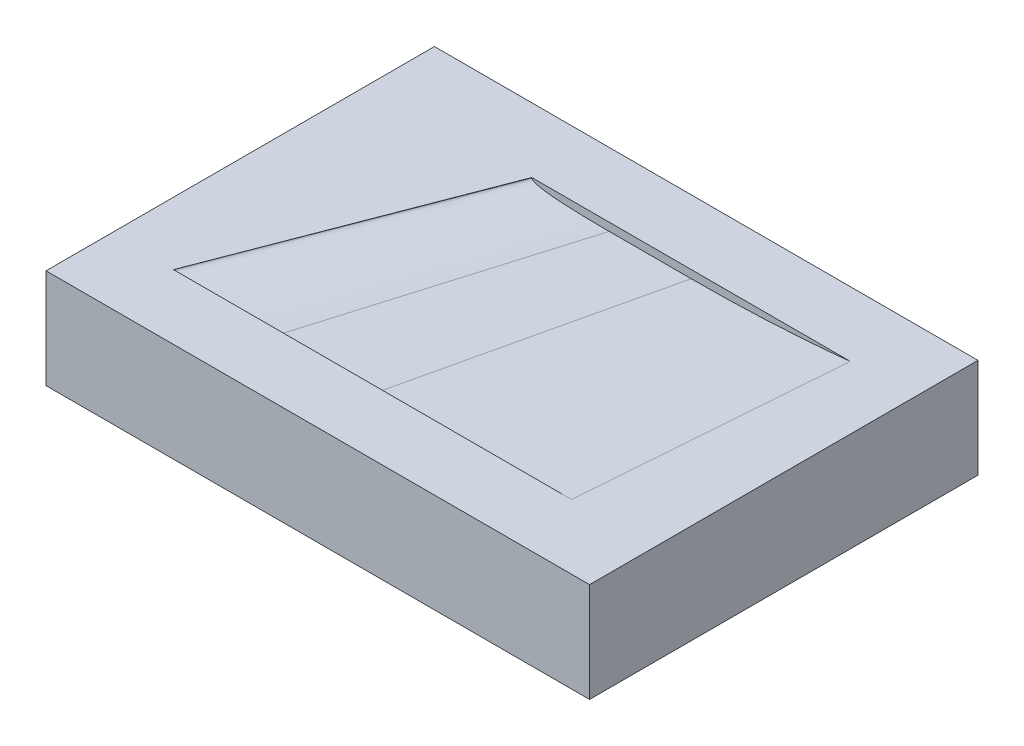
ISO-10303-21;
HEADER;
FILE_DESCRIPTION(('STEP AP214'),'2;1');
FILE_NAME('part.step','',(''),(''),'','','');
FILE_SCHEMA(('AUTOMOTIVE_DESIGN { 1 0 10303 214 1 1 1 1 }'));
ENDSEC;
DATA;
#1=APPLICATION_CONTEXT('core data for automotive mechanical design processes');
#2=APPLICATION_PROTOCOL_DEFINITION('international standard','automotive_design',2000,#1);
#3=PRODUCT_CONTEXT('',#1,'mechanical');
#4=PRODUCT('Part','Part','',(#3));
#5=PRODUCT_RELATED_PRODUCT_CATEGORY('part','',(#4));
#6=PRODUCT_DEFINITION_FORMATION('','',#4);
#7=PRODUCT_DEFINITION_CONTEXT('part definition',#1,'design');
#8=PRODUCT_DEFINITION('design','',#6,#7);
#9=PRODUCT_DEFINITION_SHAPE('','',#8);
#10=(LENGTH_UNIT() NAMED_UNIT(*) SI_UNIT(.MILLI.,.METRE.));
#11=(NAMED_UNIT(*) PLANE_ANGLE_UNIT() SI_UNIT($,.RADIAN.));
#12=(NAMED_UNIT(*) SI_UNIT($,.STERADIAN.) SOLID_ANGLE_UNIT());
#13=UNCERTAINTY_MEASURE_WITH_UNIT(LENGTH_MEASURE(1.E-05),#10,'distance_accuracy_value','');
#14=(GEOMETRIC_REPRESENTATION_CONTEXT(3) GLOBAL_UNCERTAINTY_ASSIGNED_CONTEXT((#13)) GLOBAL_UNIT_ASSIGNED_CONTEXT((#10,
#11,#12)) REPRESENTATION_CONTEXT('',''));
#15=CARTESIAN_POINT('',(0.,0.,0.));
#16=DIRECTION('',(0.,0.,1.));
#17=DIRECTION('',(1.,0.,0.));
#18=AXIS2_PLACEMENT_3D('',#15,#16,#17);
#19=CARTESIAN_POINT('',(-147.817686270369,-0.235238182718216,-4.69913597611729));
#20=DIRECTION('',(0.,-1.,0.));
#21=DIRECTION('',(1.,0.,0.));
#22=AXIS2_PLACEMENT_3D('',#19,#20,#21);
#23=PLANE('',#22);
#24=DIRECTION('',(-1.,0.,0.));
#25=VECTOR('',#24,1.);
#26=CARTESIAN_POINT('',(0.,-0.235238182718225,-4.68913597611729));
#27=LINE('',#26,#25);
#28=CARTESIAN_POINT('',(-11.3817993338851,-0.235238182718221,-4.68913597611729));
#29=VERTEX_POINT('',#28);
#30=CARTESIAN_POINT('',(-147.817686270369,-0.235238182718221,-4.68913597611729));
#31=VERTEX_POINT('',#30);
#32=EDGE_CURVE('E124',#29,#31,#27,.T.);
#33=ORIENTED_EDGE('',*,*,#32,.T.);
#34=DIRECTION('',(0.,0.,-1.));
#35=VECTOR('',#34,1.);
#36=CARTESIAN_POINT('',(-147.817686270369,-0.235238182718218,-4.68913597611729));
#37=LINE('',#36,#35);
#38=CARTESIAN_POINT('',(-147.817686270369,-0.235238182718221,92.8108640238827));
#39=VERTEX_POINT('',#38);
#40=EDGE_CURVE('E201',#39,#31,#37,.T.);
#41=ORIENTED_EDGE('',*,*,#40,.F.);
#42=DIRECTION('',(-1.,0.,0.));
#43=VECTOR('',#42,1.);
#44=CARTESIAN_POINT('',(0.,-0.235238182718225,92.8108640238827));
#45=LINE('',#44,#43);
#46=CARTESIAN_POINT('',(-11.3817993338851,-0.235238182718221,92.8108640238827));
#47=VERTEX_POINT('',#46);
#48=EDGE_CURVE('E199',#47,#39,#45,.T.);
#49=ORIENTED_EDGE('',*,*,#48,.F.);
#50=DIRECTION('',(0.,0.,1.));
#51=VECTOR('',#50,1.);
#52=CARTESIAN_POINT('',(-11.3817993338851,-0.235238182718225,-4.68913597611729));
#53=LINE('',#52,#51);
#54=EDGE_CURVE('E203',#29,#47,#53,.T.);
#55=ORIENTED_EDGE('',*,*,#54,.F.);
#56=EDGE_LOOP('',(#33,#41,#49,#55));
#57=FACE_BOUND('',#56,.T.);
#58=DIRECTION('',(-1.,0.,0.));
#59=VECTOR('',#58,1.);
#60=CARTESIAN_POINT('',(-132.075563950012,-0.235238182718217,76.5608640238827));
#61=LINE('',#60,#59);
#62=CARTESIAN_POINT('',(-32.1504797007613,-0.235238182700013,76.5608640238827));
#63=VERTEX_POINT('',#62);
#64=CARTESIAN_POINT('',(-132.07520257422,-0.235238183928665,76.5608238745016));
#65=VERTEX_POINT('',#64);
#66=EDGE_CURVE('E41',#63,#65,#61,.T.);
#67=ORIENTED_EDGE('',*,*,#66,.T.);
#68=CARTESIAN_POINT('',(-132.075140131394,-0.235238182718217,76.5608640238827));
#69=DIRECTION('',(0.358325636283721,0.,-0.933596667936356));
#70=VECTOR('',#69,1.);
#71=LINE('',#68,#70);
#72=CARTESIAN_POINT('',(-128.946982261466,-0.235238182718218,68.4106300790482));
#73=VERTEX_POINT('',#72);
#74=EDGE_CURVE('E54',#65,#73,#71,.T.);
#75=ORIENTED_EDGE('',*,*,#74,.T.);
#76=DIRECTION('',(0.358367949545301,0.,-0.933580426497201));
#77=VECTOR('',#76,1.);
#78=CARTESIAN_POINT('',(-132.075563950012,-0.235238182718217,76.5608640238827));
#79=LINE('',#78,#77);
#80=CARTESIAN_POINT('',(-107.12440167271,-0.235238182718219,11.5608640238827));
#81=VERTEX_POINT('',#80);
#82=EDGE_CURVE('E281',#73,#81,#79,.T.);
#83=ORIENTED_EDGE('',*,*,#82,.T.);
#84=DIRECTION('',(1.,0.,0.));
#85=VECTOR('',#84,1.);
#86=CARTESIAN_POINT('',(-107.12440167271,-0.235238182718219,11.5608640238827));
#87=LINE('',#86,#85);
#88=CARTESIAN_POINT('',(-27.1842803764092,-0.235238182700013,11.5608640238827));
#89=VERTEX_POINT('',#88);
#90=EDGE_CURVE('E11',#81,#89,#87,.T.);
#91=ORIENTED_EDGE('',*,*,#90,.T.);
#92=CARTESIAN_POINT('',(-27.1842803763695,-0.235238182711103,11.5608640238827));
#93=CARTESIAN_POINT('',(-27.8205460887043,-0.235238182715707,19.8886150074807));
#94=CARTESIAN_POINT('',(-28.4568118010935,-0.235238182717574,28.2163659910745));
#95=CARTESIAN_POINT('',(-29.6026445446678,-0.235238182718744,43.2135748162056));
#96=CARTESIAN_POINT('',(-30.1122115758443,-0.235238182718483,49.8830326577435));
#97=CARTESIAN_POINT('',(-31.131345638197,-0.235238182717962,63.2219483408148));
#98=CARTESIAN_POINT('',(-31.6409126693731,-0.235238182717702,69.8914061823481));
#99=CARTESIAN_POINT('',(-32.1504797005338,-0.235238182718222,76.5608640238827));
#100=B_SPLINE_CURVE_WITH_KNOTS('',3,(#92,#93,#94,#95,#96,#97,#98,#99),.UNSPECIFIED.,.F.,.F.,(4,
2,2,4),(0.,25.0560658227422,45.1227530962764,65.1894403697971),.UNSPECIFIED.);
#101=EDGE_CURVE('E63',#89,#63,#100,.T.);
#102=ORIENTED_EDGE('',*,*,#101,.T.);
#103=EDGE_LOOP('',(#67,#75,#83,#91,#102));
#104=FACE_BOUND('',#103,.T.);
#105=ADVANCED_FACE('F37',(#57,#104),#23,.F.);
#106=CARTESIAN_POINT('',(-32.0755639500123,-0.241240383306461,76.5608640238827));
#107=CARTESIAN_POINT('',(-30.4251765242449,-0.241240383306461,54.8941973572161));
#108=CARTESIAN_POINT('',(-28.7747890984775,-0.241240383306461,33.2275306905494));
#109=CARTESIAN_POINT('',(-27.1244016727102,-0.241240383306461,11.5608640238827));
#110=CARTESIAN_POINT('',(-36.2328863128886,0.0920929500268473,76.5608640238827));
#111=CARTESIAN_POINT('',(-34.3043455878615,0.0920929500268556,54.8941973572161));
#112=CARTESIAN_POINT('',(-32.3758048628345,0.0920929500268634,33.2275306905494));
#113=CARTESIAN_POINT('',(-30.4472641378075,0.0920929500268716,11.5608640238827));
#114=CARTESIAN_POINT('',(-44.5522031905363,0.675426283360143,76.5608640238827));
#115=CARTESIAN_POINT('',(-42.0675436277309,0.675426283360164,54.8941973572161));
#116=CARTESIAN_POINT('',(-39.5828840649255,0.675426283360184,33.2275306905494));
#117=CARTESIAN_POINT('',(-37.0982245021201,0.675426283360204,11.5608640238827));
#118=CARTESIAN_POINT('',(-57.0451949626936,1.30042628336013,76.5608640238827));
#119=CARTESIAN_POINT('',(-53.7269204254434,1.30042628336015,54.894197357216));
#120=CARTESIAN_POINT('',(-50.4086458881933,1.30042628336018,33.2275306905493));
#121=CARTESIAN_POINT('',(-47.0903713509431,1.3004262833602,11.5608640238827));
#122=CARTESIAN_POINT('',(-69.5522031905364,1.67542628336014,76.5608640238827));
#123=CARTESIAN_POINT('',(-65.4008769610643,1.67542628336016,54.8941973572161));
#124=CARTESIAN_POINT('',(-61.2495507315922,1.67542628336018,33.2275306905494));
#125=CARTESIAN_POINT('',(-57.0982245021201,1.6754262833602,11.5608640238828));
#126=CARTESIAN_POINT('',(-77.8995529795552,1.75875961669351,76.5608640238827));
#127=CARTESIAN_POINT('',(-73.1932344767504,1.75875961669352,54.8941973572161));
#128=CARTESIAN_POINT('',(-68.4869159739456,1.75875961669353,33.2275306905494));
#129=CARTESIAN_POINT('',(-63.7805974711408,1.75875961669354,11.5608640238827));
#130=CARTESIAN_POINT('',(-82.0755639500123,1.75875961669354,76.5608640238827));
#131=CARTESIAN_POINT('',(-77.0918431909116,1.75875961669354,54.8941973572161));
#132=CARTESIAN_POINT('',(-72.1081224318109,1.75875961669354,33.2275306905494));
#133=CARTESIAN_POINT('',(-67.1244016727102,1.75875961669354,11.5608640238827));
#134=B_SPLINE_SURFACE_WITH_KNOTS('',3,3,((#106,#107,#108,#109),(#110,#111,#112,#113),(#114,#115,
#116,#117),(#118,#119,#120,#121),(#122,#123,#124,#125),(#126,#127,#128,#129),(#130,#131,#132,
#133)),.UNSPECIFIED.,.F.,.F.,.F.,(4,1,1,1,4),(4,4),(0.,0.122335441753358,0.244670883506716,
0.367006325260075,0.489341767013433),(0.,1.),.UNSPECIFIED.);
#135=CARTESIAN_POINT('',(-67.1244016727102,1.75875961669354,11.5608640238827));
#136=CARTESIAN_POINT('',(-47.0615764632941,1.75875961669354,11.5608640238827));
#137=CARTESIAN_POINT('',(-27.1244016727102,-0.241240383306461,11.5608640238827));
#138=B_SPLINE_CURVE_WITH_KNOTS('',2,(#135,#136,#137),.UNSPECIFIED.,.F.,.F.,(3,3),(0.,1.),.UNSPECIFIED.);
#139=CARTESIAN_POINT('',(-27.1244016727102,-0.241240383306461,11.5608640238827));
#140=VERTEX_POINT('',#139);
#141=EDGE_CURVE('E167',#89,#140,#138,.T.);
#142=DIRECTION('',(0.0759517051198801,0.,-0.997111497521407));
#143=VECTOR('',#142,1.);
#144=CARTESIAN_POINT('',(-29.5999828113612,-0.241240383306461,44.0608640238827));
#145=LINE('',#144,#143);
#146=CARTESIAN_POINT('',(-32.0755639500123,-0.241240383306461,76.5608640238827));
#147=VERTEX_POINT('',#146);
#148=EDGE_CURVE('E154',#147,#140,#145,.T.);
#149=CARTESIAN_POINT('',(-82.0755639500123,1.75875961669354,76.5608640238827));
#150=CARTESIAN_POINT('',(-57.0194981272701,1.75875961669339,76.5608640238827));
#151=CARTESIAN_POINT('',(-32.0755639500123,-0.241240383306461,76.5608640238827));
#152=B_SPLINE_CURVE_WITH_KNOTS('',2,(#149,#150,#151),.UNSPECIFIED.,.F.,.F.,(3,3),(0.,1.),.UNSPECIFIED.);
#153=EDGE_CURVE('E197',#63,#147,#152,.T.);
#154=ORIENTED_EDGE('',*,*,#101,.F.);
#155=ORIENTED_EDGE('',*,*,#141,.T.);
#156=ORIENTED_EDGE('',*,*,#148,.F.);
#157=ORIENTED_EDGE('',*,*,#153,.F.);
#158=EDGE_LOOP('',(#154,#155,#156,#157));
#159=FACE_BOUND('',#158,.T.);
#160=ADVANCED_FACE('F237',(#159),#134,.T.);
#161=CARTESIAN_POINT('',(-82.0755639500123,-2.24124038330646,76.5608640238827));
#162=CARTESIAN_POINT('',(-67.1244016727102,-2.24124038330646,11.5608640238827));
#163=CARTESIAN_POINT('',(-57.0194981272701,-2.24124038330631,76.5608640238827));
#164=CARTESIAN_POINT('',(-47.0615764632941,-2.24124038330646,11.5608640238827));
#165=CARTESIAN_POINT('',(-32.0755639500123,-0.241240383306461,76.5608640238827));
#166=CARTESIAN_POINT('',(-27.1244016727102,-0.241240383306461,11.5608640238827));
#167=B_SPLINE_SURFACE_WITH_KNOTS('',2,1,((#161,#162),(#163,#164),(#165,#166)),.UNSPECIFIED.,.F.,
.F.,.F.,(3,3),(2,2),(0.,1.),(0.,1.),.UNSPECIFIED.);
#168=CARTESIAN_POINT('',(-82.0755639500123,-2.24124038330646,76.5608640238827));
#169=CARTESIAN_POINT('',(-57.0194981272701,-2.24124038330631,76.5608640238827));
#170=CARTESIAN_POINT('',(-32.0755639500123,-0.241240383306461,76.5608640238827));
#171=B_SPLINE_CURVE_WITH_KNOTS('',2,(#168,#169,#170),.UNSPECIFIED.,.F.,.F.,(3,3),(0.,1.),.UNSPECIFIED.);
#172=CARTESIAN_POINT('',(-82.0755639500123,-2.24124038330646,76.5608640238827));
#173=VERTEX_POINT('',#172);
#174=EDGE_CURVE('E163',#173,#147,#171,.T.);
#175=CARTESIAN_POINT('',(-67.1244016727102,-2.24124038330646,11.5608640238827));
#176=CARTESIAN_POINT('',(-47.0615764632941,-2.24124038330646,11.5608640238827));
#177=CARTESIAN_POINT('',(-27.1244016727102,-0.241240383306461,11.5608640238827));
#178=B_SPLINE_CURVE_WITH_KNOTS('',2,(#175,#176,#177),.UNSPECIFIED.,.F.,.F.,(3,3),(0.,1.),.UNSPECIFIED.);
#179=CARTESIAN_POINT('',(-67.1244016727102,-2.24124038330646,11.5608640238827));
#180=VERTEX_POINT('',#179);
#181=EDGE_CURVE('E159',#180,#140,#178,.T.);
#182=DIRECTION('',(0.224164243499484,0.,-0.974551379833975));
#183=VECTOR('',#182,1.);
#184=CARTESIAN_POINT('',(-82.0755639500123,-2.24124038330646,76.5608640238827));
#185=LINE('',#184,#183);
#186=EDGE_CURVE('E158',#173,#180,#185,.T.);
#187=ORIENTED_EDGE('',*,*,#174,.T.);
#188=ORIENTED_EDGE('',*,*,#148,.T.);
#189=ORIENTED_EDGE('',*,*,#181,.F.);
#190=ORIENTED_EDGE('',*,*,#186,.F.);
#191=EDGE_LOOP('',(#187,#188,#189,#190));
#192=FACE_BOUND('',#191,.T.);
#193=ADVANCED_FACE('F242',(#192),#167,.T.);
#194=CARTESIAN_POINT('',(-132.075563950012,-0.241240383306461,76.5608640238827));
#195=CARTESIAN_POINT('',(-107.12440167271,-0.289109320673951,11.5608640238827));
#196=CARTESIAN_POINT('',(-132.068851844272,-0.35141683002973,76.5608640238827));
#197=CARTESIAN_POINT('',(-107.119167992619,-0.375211956609364,11.5608640238827));
#198=CARTESIAN_POINT('',(-131.949074539636,-0.526410123201769,76.5608640238828));
#199=CARTESIAN_POINT('',(-107.058214426977,-0.514133425696137,11.5608640238827));
#200=CARTESIAN_POINT('',(-131.758263658057,-0.655288657685514,76.5608640238827));
#201=CARTESIAN_POINT('',(-106.927122412681,-0.642017576442922,11.5608640238827));
#202=CARTESIAN_POINT('',(-131.453575460088,-0.825230430841971,76.5608640238826));
#203=CARTESIAN_POINT('',(-106.705011260519,-0.812986717959981,11.5608640238827));
#204=CARTESIAN_POINT('',(-131.171109632352,-0.92410562595963,76.5608640238826));
#205=CARTESIAN_POINT('',(-106.494612038344,-0.915826538155211,11.5608640238827));
#206=CARTESIAN_POINT('',(-130.587712513025,-1.09491573436706,76.5608640238827));
#207=CARTESIAN_POINT('',(-106.051383480333,-1.08798537267806,11.5608640238828));
#208=CARTESIAN_POINT('',(-130.178022398801,-1.18498161344138,76.5608640238827));
#209=CARTESIAN_POINT('',(-105.736258132447,-1.17930330978814,11.5608640238828));
#210=CARTESIAN_POINT('',(-129.178619839801,-1.37348519590354,76.5608640238828));
#211=CARTESIAN_POINT('',(-104.963558169305,-1.36805954177404,11.5608640238828));
#212=CARTESIAN_POINT('',(-128.462439032159,-1.47070214323913,76.5608640238828));
#213=CARTESIAN_POINT('',(-104.406904388195,-1.46606131852879,11.5608640238827));
#214=CARTESIAN_POINT('',(-127.173532932439,-1.6174453457072,76.5608640238827));
#215=CARTESIAN_POINT('',(-103.403134288348,-1.61272291381621,11.5608640238827));
#216=CARTESIAN_POINT('',(-126.474438820649,-1.68265651488475,76.5608640238827));
#217=CARTESIAN_POINT('',(-102.857955699797,-1.67796248823595,11.5608640238827));
#218=CARTESIAN_POINT('',(-124.168055687845,-1.87050332577562,76.5608640238827));
#219=CARTESIAN_POINT('',(-101.058209544952,-1.86535168991131,11.5608640238827));
#220=CARTESIAN_POINT('',(-122.441361531747,-1.95944003812852,76.5608640238827));
#221=CARTESIAN_POINT('',(-99.7090254395894,-1.95453311586651,11.5608640238827));
#222=CARTESIAN_POINT('',(-116.208678860393,-2.20644055577695,76.5608640238827));
#223=CARTESIAN_POINT('',(-94.8376681949716,-2.20172204963652,11.5608640238828));
#224=CARTESIAN_POINT('',(-111.62562716501,-2.24124038330646,76.5608640238827));
#225=CARTESIAN_POINT('',(-91.2534745936992,-2.23863983084044,11.5608640238827));
#226=CARTESIAN_POINT('',(-107.075563950012,-2.24124038330646,76.5608640238827));
#227=CARTESIAN_POINT('',(-87.6955032234398,-2.24124054963858,11.5608640238827));
#228=B_SPLINE_SURFACE_WITH_KNOTS('',3,1,((#194,#195),(#196,#197),(#198,#199),(#200,#201),(#202,
#203),(#204,#205),(#206,#207),(#208,#209),(#210,#211),(#212,#213),(#214,#215),(#216,#217),(#218,
#219),(#220,#221),(#222,#223),(#224,#225),(#226,#227)),.UNSPECIFIED.,.F.,.F.,.F.,(4,1,1,1,1,1,1,
1,1,1,1,1,1,1,4),(2,2),(0.,0.0130335558260233,0.0236646502785043,0.0270654432242707,
0.0543505595370666,0.0588989819291337,0.0988700618423399,0.103921517030962,0.179200697813376,
0.184331067599725,0.257356535356878,0.262237314930706,0.458038546790629,0.461820218702176,1.),
(0.,1.),.UNSPECIFIED.);
#229=CARTESIAN_POINT('',(-132.075563950012,-0.241240383306461,76.5608640238827));
#230=CARTESIAN_POINT('',(-132.068851844272,-0.35141683002973,76.5608640238827));
#231=CARTESIAN_POINT('',(-131.949074539636,-0.526410123201769,76.5608640238828));
#232=CARTESIAN_POINT('',(-131.758263658057,-0.655288657685514,76.5608640238827));
#233=CARTESIAN_POINT('',(-131.453575460088,-0.825230430841971,76.5608640238826));
#234=CARTESIAN_POINT('',(-131.171109632352,-0.92410562595963,76.5608640238826));
#235=CARTESIAN_POINT('',(-130.587712513025,-1.09491573436706,76.5608640238827));
#236=CARTESIAN_POINT('',(-130.178022398801,-1.18498161344138,76.5608640238827));
#237=CARTESIAN_POINT('',(-129.178619839801,-1.37348519590354,76.5608640238828));
#238=CARTESIAN_POINT('',(-128.462439032159,-1.47070214323913,76.5608640238828));
#239=CARTESIAN_POINT('',(-127.173532932439,-1.6174453457072,76.5608640238827));
#240=CARTESIAN_POINT('',(-126.474438820649,-1.68265651488475,76.5608640238827));
#241=CARTESIAN_POINT('',(-124.168055687845,-1.87050332577562,76.5608640238827));
#242=CARTESIAN_POINT('',(-122.441361531747,-1.95944003812852,76.5608640238827));
#243=CARTESIAN_POINT('',(-116.208678860393,-2.20644055577695,76.5608640238827));
#244=CARTESIAN_POINT('',(-111.62562716501,-2.24124038330646,76.5608640238827));
#245=CARTESIAN_POINT('',(-107.075563950012,-2.24124038330646,76.5608640238827));
#246=B_SPLINE_CURVE_WITH_KNOTS('',3,(#229,#230,#231,#232,#233,#234,#235,#236,#237,#238,#239,
#240,#241,#242,#243,#244,#245),.UNSPECIFIED.,.F.,.F.,(4,1,1,1,1,1,1,1,1,1,1,1,1,1,4),(0.,
0.0130335558260233,0.0236646502785043,0.0270654432242707,0.0543505595370666,0.0588989819291337,
0.0988700618423399,0.103921517030962,0.179200697813376,0.184331067599725,0.257356535356878,
0.262237314930706,0.458038546790629,0.461820218702176,1.),.UNSPECIFIED.);
#247=CARTESIAN_POINT('',(-107.075563950012,-2.24124038330646,76.5608640238827));
#248=VERTEX_POINT('',#247);
#249=EDGE_CURVE('E292',#65,#248,#246,.T.);
#250=DIRECTION('',(0.285725184112015,-2.4522769170667E-09,-0.958311598158008));
#251=VECTOR('',#250,1.);
#252=CARTESIAN_POINT('',(-97.385533586726,-2.24124046647252,44.0608640238827));
#253=LINE('',#252,#251);
#254=CARTESIAN_POINT('',(-87.6956169688151,-2.24124038330646,11.5608640238827));
#255=VERTEX_POINT('',#254);
#256=EDGE_CURVE('E306',#248,#255,#253,.T.);
#257=CARTESIAN_POINT('',(-87.6955032234398,-2.24124054963858,11.5608640238827));
#258=CARTESIAN_POINT('',(-91.2534745936992,-2.23863983084044,11.5608640238827));
#259=CARTESIAN_POINT('',(-94.8376681949716,-2.20172204963652,11.5608640238828));
#260=CARTESIAN_POINT('',(-99.7090254395894,-1.95453311586651,11.5608640238827));
#261=CARTESIAN_POINT('',(-101.058209544952,-1.86535168991131,11.5608640238827));
#262=CARTESIAN_POINT('',(-102.857955699797,-1.67796248823595,11.5608640238827));
#263=CARTESIAN_POINT('',(-103.403134288348,-1.61272291381621,11.5608640238827));
#264=CARTESIAN_POINT('',(-104.406904388195,-1.46606131852879,11.5608640238827));
#265=CARTESIAN_POINT('',(-104.963558169305,-1.36805954177404,11.5608640238828));
#266=CARTESIAN_POINT('',(-105.736258132447,-1.17930330978814,11.5608640238828));
#267=CARTESIAN_POINT('',(-106.051383480333,-1.08798537267806,11.5608640238828));
#268=CARTESIAN_POINT('',(-106.494612038344,-0.915826538155211,11.5608640238827));
#269=CARTESIAN_POINT('',(-106.705011260519,-0.812986717959981,11.5608640238827));
#270=CARTESIAN_POINT('',(-106.927122412681,-0.642017576442922,11.5608640238827));
#271=CARTESIAN_POINT('',(-107.058214426977,-0.514133425696137,11.5608640238827));
#272=CARTESIAN_POINT('',(-107.119167992619,-0.375211956609364,11.5608640238827));
#273=CARTESIAN_POINT('',(-107.12440167271,-0.289109320673951,11.5608640238827));
#274=B_SPLINE_CURVE_WITH_KNOTS('',3,(#257,#258,#259,#260,#261,#262,#263,#264,#265,#266,#267,
#268,#269,#270,#271,#272,#273),.UNSPECIFIED.,.F.,.F.,(4,1,1,1,1,1,1,1,1,1,1,1,1,1,4),(0.,
0.538179781297824,0.541961453209371,0.737762685069294,0.742643464643122,0.815668932400275,
0.820799302186624,0.896078482969038,0.90112993815766,0.941101018070866,0.945649440462933,
0.972934556775729,0.976335349721496,0.986966444173977,1.),.UNSPECIFIED.);
#275=CARTESIAN_POINT('',(-107.12440167271,-0.289109320673973,11.5608640238827));
#276=VERTEX_POINT('',#275);
#277=EDGE_CURVE('E304',#276,#255,#274,.F.);
#278=DIRECTION('',(0.358367864845314,-0.000687530652326152,-0.933580205846189));
#279=VECTOR('',#278,1.);
#280=CARTESIAN_POINT('',(-132.075563950012,-0.241240383306461,76.5608640238827));
#281=LINE('',#280,#279);
#282=EDGE_CURVE('E299',#65,#276,#281,.T.);
#283=ORIENTED_EDGE('',*,*,#249,.T.);
#284=ORIENTED_EDGE('',*,*,#256,.T.);
#285=ORIENTED_EDGE('',*,*,#277,.F.);
#286=ORIENTED_EDGE('',*,*,#282,.F.);
#287=EDGE_LOOP('',(#283,#284,#285,#286));
#288=FACE_BOUND('',#287,.T.);
#289=ADVANCED_FACE('F221',(#288),#228,.T.);
#290=CARTESIAN_POINT('',(-132.075563950012,1.75875961669354,76.5608640238827));
#291=DIRECTION('',(0.933580426497201,0.,0.358367949545301));
#292=DIRECTION('',(0.358367949545301,0.,-0.933580426497201));
#293=AXIS2_PLACEMENT_3D('',#290,#291,#292);
#294=PLANE('',#293);
#295=ORIENTED_EDGE('',*,*,#82,.F.);
#296=ORIENTED_EDGE('',*,*,#74,.F.);
#297=ORIENTED_EDGE('',*,*,#282,.T.);
#298=DIRECTION('',(0.,-1.,0.));
#299=VECTOR('',#298,1.);
#300=CARTESIAN_POINT('',(-107.12440167271,1.75875961669354,11.5608640238827));
#301=LINE('',#300,#299);
#302=EDGE_CURVE('E142',#81,#276,#301,.T.);
#303=ORIENTED_EDGE('',*,*,#302,.F.);
#304=EDGE_LOOP('',(#295,#296,#297,#303));
#305=FACE_BOUND('',#304,.T.);
#306=ADVANCED_FACE('F211',(#305),#294,.T.);
#307=CARTESIAN_POINT('',(-73.7693626848444,-2.24124038330646,40.4497529127716));
#308=DIRECTION('',(0.,-1.,0.));
#309=DIRECTION('',(0.,0.,-1.));
#310=AXIS2_PLACEMENT_3D('',#307,#308,#309);
#311=PLANE('',#310);
#312=DIRECTION('',(-1.,0.,0.));
#313=VECTOR('',#312,1.);
#314=CARTESIAN_POINT('',(-107.12440167271,-2.24124038330646,11.5608640238827));
#315=LINE('',#314,#313);
#316=EDGE_CURVE('E342',#180,#255,#315,.T.);
#317=ORIENTED_EDGE('',*,*,#316,.T.);
#318=ORIENTED_EDGE('',*,*,#256,.F.);
#319=DIRECTION('',(1.,0.,0.));
#320=VECTOR('',#319,1.);
#321=CARTESIAN_POINT('',(-132.075563950012,-2.24124038330646,76.5608640238827));
#322=LINE('',#321,#320);
#323=EDGE_CURVE('E144',#248,#173,#322,.T.);
#324=ORIENTED_EDGE('',*,*,#323,.T.);
#325=ORIENTED_EDGE('',*,*,#186,.T.);
#326=EDGE_LOOP('',(#317,#318,#324,#325));
#327=FACE_BOUND('',#326,.T.);
#328=ADVANCED_FACE('F220',(#327),#311,.F.);
#329=CARTESIAN_POINT('',(-132.075563950012,1.75875961669354,76.5608640238827));
#330=DIRECTION('',(0.,0.,-1.));
#331=DIRECTION('',(-1.,0.,0.));
#332=AXIS2_PLACEMENT_3D('',#329,#330,#331);
#333=PLANE('',#332);
#334=ORIENTED_EDGE('',*,*,#66,.F.);
#335=ORIENTED_EDGE('',*,*,#153,.T.);
#336=ORIENTED_EDGE('',*,*,#174,.F.);
#337=ORIENTED_EDGE('',*,*,#323,.F.);
#338=ORIENTED_EDGE('',*,*,#249,.F.);
#339=EDGE_LOOP('',(#334,#335,#336,#337,#338));
#340=FACE_BOUND('',#339,.T.);
#341=ADVANCED_FACE('F222',(#340),#333,.T.);
#342=CARTESIAN_POINT('',(-107.12440167271,1.75875961669354,11.5608640238827));
#343=DIRECTION('',(0.,0.,1.));
#344=DIRECTION('',(1.,0.,0.));
#345=AXIS2_PLACEMENT_3D('',#342,#343,#344);
#346=PLANE('',#345);
#347=ORIENTED_EDGE('',*,*,#90,.F.);
#348=ORIENTED_EDGE('',*,*,#302,.T.);
#349=ORIENTED_EDGE('',*,*,#277,.T.);
#350=ORIENTED_EDGE('',*,*,#316,.F.);
#351=ORIENTED_EDGE('',*,*,#181,.T.);
#352=ORIENTED_EDGE('',*,*,#141,.F.);
#353=EDGE_LOOP('',(#347,#348,#349,#350,#351,#352));
#354=FACE_BOUND('',#353,.T.);
#355=ADVANCED_FACE('F225',(#354),#346,.T.);
#356=CARTESIAN_POINT('',(-11.3817993338851,-25.1977244290418,-4.68913597611729));
#357=DIRECTION('',(0.,1.,0.));
#358=DIRECTION('',(0.,0.,1.));
#359=AXIS2_PLACEMENT_3D('',#356,#357,#358);
#360=PLANE('',#359);
#361=DIRECTION('',(-1.,0.,0.));
#362=VECTOR('',#361,1.);
#363=CARTESIAN_POINT('',(-11.3817993338851,-25.1977244290418,92.8108640238827));
#364=LINE('',#363,#362);
#365=CARTESIAN_POINT('',(-11.3817993338851,-25.1977244290418,92.8108640238827));
#366=VERTEX_POINT('',#365);
#367=CARTESIAN_POINT('',(-147.817686270369,-25.1977244290418,92.8108640238827));
#368=VERTEX_POINT('',#367);
#369=EDGE_CURVE('E439',#366,#368,#364,.T.);
#370=ORIENTED_EDGE('',*,*,#369,.T.);
#371=DIRECTION('',(0.,0.,1.));
#372=VECTOR('',#371,1.);
#373=CARTESIAN_POINT('',(-147.817686270369,-25.1977244290418,-4.68913597611729));
#374=LINE('',#373,#372);
#375=CARTESIAN_POINT('',(-147.817686270369,-25.1977244290418,-4.68913597611729));
#376=VERTEX_POINT('',#375);
#377=EDGE_CURVE('E134',#376,#368,#374,.T.);
#378=ORIENTED_EDGE('',*,*,#377,.F.);
#379=DIRECTION('',(-1.,0.,0.));
#380=VECTOR('',#379,1.);
#381=CARTESIAN_POINT('',(-11.3817993338851,-25.1977244290418,-4.68913597611729));
#382=LINE('',#381,#380);
#383=CARTESIAN_POINT('',(-11.3817993338851,-25.1977244290418,-4.68913597611729));
#384=VERTEX_POINT('',#383);
#385=EDGE_CURVE('E121',#384,#376,#382,.T.);
#386=ORIENTED_EDGE('',*,*,#385,.F.);
#387=DIRECTION('',(0.,0.,1.));
#388=VECTOR('',#387,1.);
#389=CARTESIAN_POINT('',(-11.3817993338851,-25.1977244290418,-4.68913597611729));
#390=LINE('',#389,#388);
#391=EDGE_CURVE('E132',#384,#366,#390,.T.);
#392=ORIENTED_EDGE('',*,*,#391,.T.);
#393=EDGE_LOOP('',(#370,#378,#386,#392));
#394=FACE_BOUND('',#393,.T.);
#395=ADVANCED_FACE('F131',(#394),#360,.F.);
#396=CARTESIAN_POINT('',(-147.817686270369,24.7272480636053,-4.68913597611729));
#397=DIRECTION('',(1.,0.,0.));
#398=DIRECTION('',(0.,0.,-1.));
#399=AXIS2_PLACEMENT_3D('',#396,#397,#398);
#400=PLANE('',#399);
#401=DIRECTION('',(0.,1.,0.));
#402=VECTOR('',#401,1.);
#403=CARTESIAN_POINT('',(-147.817686270369,24.7272480636053,92.8108640238827));
#404=LINE('',#403,#402);
#405=EDGE_CURVE('E127',#368,#39,#404,.T.);
#406=ORIENTED_EDGE('',*,*,#405,.T.);
#407=ORIENTED_EDGE('',*,*,#40,.T.);
#408=DIRECTION('',(0.,1.,0.));
#409=VECTOR('',#408,1.);
#410=CARTESIAN_POINT('',(-147.817686270369,24.7272480636053,-4.68913597611729));
#411=LINE('',#410,#409);
#412=EDGE_CURVE('E136',#376,#31,#411,.T.);
#413=ORIENTED_EDGE('',*,*,#412,.F.);
#414=ORIENTED_EDGE('',*,*,#377,.T.);
#415=EDGE_LOOP('',(#406,#407,#413,#414));
#416=FACE_BOUND('',#415,.T.);
#417=ADVANCED_FACE('F233',(#416),#400,.F.);
#418=CARTESIAN_POINT('',(-11.3817993338851,24.7272480636053,-4.68913597611729));
#419=DIRECTION('',(-1.,0.,0.));
#420=DIRECTION('',(0.,0.,1.));
#421=AXIS2_PLACEMENT_3D('',#418,#419,#420);
#422=PLANE('',#421);
#423=DIRECTION('',(0.,-1.,0.));
#424=VECTOR('',#423,1.);
#425=CARTESIAN_POINT('',(-11.3817993338851,24.7272480636053,-4.68913597611729));
#426=LINE('',#425,#424);
#427=EDGE_CURVE('E117',#29,#384,#426,.T.);
#428=ORIENTED_EDGE('',*,*,#427,.F.);
#429=ORIENTED_EDGE('',*,*,#54,.T.);
#430=DIRECTION('',(0.,-1.,0.));
#431=VECTOR('',#430,1.);
#432=CARTESIAN_POINT('',(-11.3817993338851,24.7272480636053,92.8108640238827));
#433=LINE('',#432,#431);
#434=EDGE_CURVE('E140',#47,#366,#433,.T.);
#435=ORIENTED_EDGE('',*,*,#434,.T.);
#436=ORIENTED_EDGE('',*,*,#391,.F.);
#437=EDGE_LOOP('',(#428,#429,#435,#436));
#438=FACE_BOUND('',#437,.T.);
#439=ADVANCED_FACE('F138',(#438),#422,.F.);
#440=CARTESIAN_POINT('',(0.,0.,92.8108640238827));
#441=DIRECTION('',(0.,0.,-1.));
#442=DIRECTION('',(-1.,0.,0.));
#443=AXIS2_PLACEMENT_3D('',#440,#441,#442);
#444=PLANE('',#443);
#445=ORIENTED_EDGE('',*,*,#434,.F.);
#446=ORIENTED_EDGE('',*,*,#48,.T.);
#447=ORIENTED_EDGE('',*,*,#405,.F.);
#448=ORIENTED_EDGE('',*,*,#369,.F.);
#449=EDGE_LOOP('',(#445,#446,#447,#448));
#450=FACE_BOUND('',#449,.T.);
#451=ADVANCED_FACE('F246',(#450),#444,.F.);
#452=CARTESIAN_POINT('',(0.,0.,-4.68913597611729));
#453=DIRECTION('',(0.,0.,-1.));
#454=DIRECTION('',(-1.,0.,0.));
#455=AXIS2_PLACEMENT_3D('',#452,#453,#454);
#456=PLANE('',#455);
#457=ORIENTED_EDGE('',*,*,#32,.F.);
#458=ORIENTED_EDGE('',*,*,#427,.T.);
#459=ORIENTED_EDGE('',*,*,#385,.T.);
#460=ORIENTED_EDGE('',*,*,#412,.T.);
#461=EDGE_LOOP('',(#457,#458,#459,#460));
#462=FACE_BOUND('',#461,.T.);
#463=ADVANCED_FACE('F119',(#462),#456,.T.);
#464=CLOSED_SHELL('',(#105,#160,#193,#289,#306,#328,#341,#355,#395,#417,#439,#451,#463));
#465=MANIFOLD_SOLID_BREP('B2',#464);
#466=ADVANCED_BREP_SHAPE_REPRESENTATION('',(#18,#465),#14);
#467=SHAPE_DEFINITION_REPRESENTATION(#9,#466);
ENDSEC;
END-ISO-10303-21;
